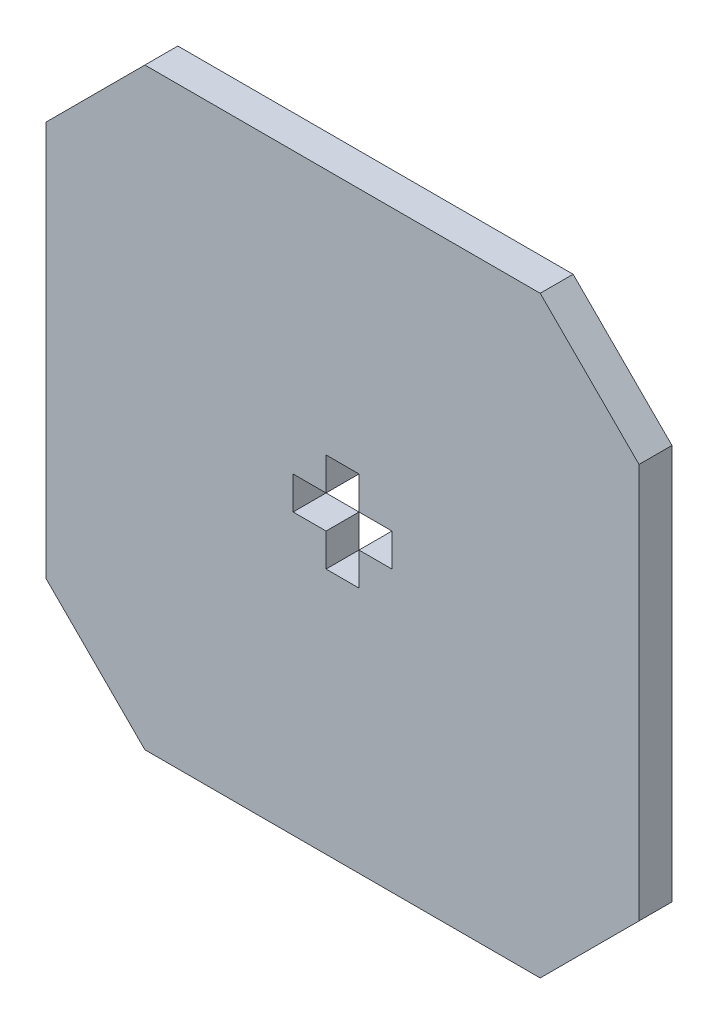
ISO-10303-21;
HEADER;
FILE_DESCRIPTION(('STEP AP214'),'2;1');
FILE_NAME('part.step','',(''),(''),'','','');
FILE_SCHEMA(('AUTOMOTIVE_DESIGN { 1 0 10303 214 1 1 1 1 }'));
ENDSEC;
DATA;
#1=APPLICATION_CONTEXT('core data for automotive mechanical design processes');
#2=APPLICATION_PROTOCOL_DEFINITION('international standard','automotive_design',2000,#1);
#3=PRODUCT_CONTEXT('',#1,'mechanical');
#4=PRODUCT('Part','Part','',(#3));
#5=PRODUCT_RELATED_PRODUCT_CATEGORY('part','',(#4));
#6=PRODUCT_DEFINITION_FORMATION('','',#4);
#7=PRODUCT_DEFINITION_CONTEXT('part definition',#1,'design');
#8=PRODUCT_DEFINITION('design','',#6,#7);
#9=PRODUCT_DEFINITION_SHAPE('','',#8);
#10=(LENGTH_UNIT() NAMED_UNIT(*) SI_UNIT(.MILLI.,.METRE.));
#11=(NAMED_UNIT(*) PLANE_ANGLE_UNIT() SI_UNIT($,.RADIAN.));
#12=(NAMED_UNIT(*) SI_UNIT($,.STERADIAN.) SOLID_ANGLE_UNIT());
#13=UNCERTAINTY_MEASURE_WITH_UNIT(LENGTH_MEASURE(1.E-05),#10,'distance_accuracy_value','');
#14=(GEOMETRIC_REPRESENTATION_CONTEXT(3) GLOBAL_UNCERTAINTY_ASSIGNED_CONTEXT((#13)) GLOBAL_UNIT_ASSIGNED_CONTEXT((#10,
#11,#12)) REPRESENTATION_CONTEXT('',''));
#15=CARTESIAN_POINT('',(0.,0.,0.));
#16=DIRECTION('',(0.,0.,1.));
#17=DIRECTION('',(1.,0.,0.));
#18=AXIS2_PLACEMENT_3D('',#15,#16,#17);
#19=CARTESIAN_POINT('',(0.,0.,3.));
#20=DIRECTION('',(0.,0.,-1.));
#21=DIRECTION('',(-1.,0.,0.));
#22=AXIS2_PLACEMENT_3D('',#19,#20,#21);
#23=PLANE('',#22);
#24=DIRECTION('',(0.,1.,0.));
#25=VECTOR('',#24,1.);
#26=CARTESIAN_POINT('',(336.000004860086,287.999995210216,3.));
#27=LINE('',#26,#25);
#28=CARTESIAN_POINT('',(336.000004860086,251.999995210216,3.));
#29=VERTEX_POINT('',#28);
#30=CARTESIAN_POINT('',(336.000004860086,287.999995210216,3.));
#31=VERTEX_POINT('',#30);
#32=EDGE_CURVE('E264',#29,#31,#27,.T.);
#33=ORIENTED_EDGE('',*,*,#32,.T.);
#34=DIRECTION('',(-0.707106781186548,0.707106781186548,0.));
#35=VECTOR('',#34,1.);
#36=CARTESIAN_POINT('',(327.000004860086,296.999995210216,3.));
#37=LINE('',#36,#35);
#38=CARTESIAN_POINT('',(327.000004860086,296.999995210216,3.));
#39=VERTEX_POINT('',#38);
#40=EDGE_CURVE('E267',#31,#39,#37,.T.);
#41=ORIENTED_EDGE('',*,*,#40,.T.);
#42=DIRECTION('',(-1.,0.,0.));
#43=VECTOR('',#42,1.);
#44=CARTESIAN_POINT('',(291.000004860086,296.999995210216,3.));
#45=LINE('',#44,#43);
#46=CARTESIAN_POINT('',(291.000004860086,296.999995210216,3.));
#47=VERTEX_POINT('',#46);
#48=EDGE_CURVE('E270',#39,#47,#45,.T.);
#49=ORIENTED_EDGE('',*,*,#48,.T.);
#50=DIRECTION('',(-0.707106781186548,-0.707106781186548,0.));
#51=VECTOR('',#50,1.);
#52=CARTESIAN_POINT('',(282.000004860086,287.999995210216,3.));
#53=LINE('',#52,#51);
#54=CARTESIAN_POINT('',(282.000004860086,287.999995210216,3.));
#55=VERTEX_POINT('',#54);
#56=EDGE_CURVE('E272',#47,#55,#53,.T.);
#57=ORIENTED_EDGE('',*,*,#56,.T.);
#58=DIRECTION('',(0.,-1.,0.));
#59=VECTOR('',#58,1.);
#60=CARTESIAN_POINT('',(282.000004860086,251.999995210216,3.));
#61=LINE('',#60,#59);
#62=CARTESIAN_POINT('',(282.000004860086,251.999995210216,3.));
#63=VERTEX_POINT('',#62);
#64=EDGE_CURVE('E274',#55,#63,#61,.T.);
#65=ORIENTED_EDGE('',*,*,#64,.T.);
#66=DIRECTION('',(0.707106781186549,-0.707106781186546,0.));
#67=VECTOR('',#66,1.);
#68=CARTESIAN_POINT('',(291.000004860086,242.999995210216,3.));
#69=LINE('',#68,#67);
#70=CARTESIAN_POINT('',(291.000004860086,242.999995210216,3.));
#71=VERTEX_POINT('',#70);
#72=EDGE_CURVE('E276',#63,#71,#69,.T.);
#73=ORIENTED_EDGE('',*,*,#72,.T.);
#74=DIRECTION('',(1.,0.,0.));
#75=VECTOR('',#74,1.);
#76=CARTESIAN_POINT('',(327.000004860086,242.999995210216,3.));
#77=LINE('',#76,#75);
#78=CARTESIAN_POINT('',(327.000004860086,242.999995210216,3.));
#79=VERTEX_POINT('',#78);
#80=EDGE_CURVE('E278',#71,#79,#77,.T.);
#81=ORIENTED_EDGE('',*,*,#80,.T.);
#82=DIRECTION('',(0.707106781186549,0.707106781186546,0.));
#83=VECTOR('',#82,1.);
#84=CARTESIAN_POINT('',(336.000004860086,251.999995210216,3.));
#85=LINE('',#84,#83);
#86=EDGE_CURVE('E280',#79,#29,#85,.T.);
#87=ORIENTED_EDGE('',*,*,#86,.T.);
#88=EDGE_LOOP('',(#33,#41,#49,#57,#65,#73,#81,#87));
#89=FACE_BOUND('',#88,.T.);
#90=DIRECTION('',(-1.,0.,0.));
#91=VECTOR('',#90,1.);
#92=CARTESIAN_POINT('',(310.500004860086,274.499995210216,3.));
#93=LINE('',#92,#91);
#94=CARTESIAN_POINT('',(310.500004860086,274.499995210216,3.));
#95=VERTEX_POINT('',#94);
#96=CARTESIAN_POINT('',(307.500004860086,274.499995210216,3.));
#97=VERTEX_POINT('',#96);
#98=EDGE_CURVE('E171',#95,#97,#93,.T.);
#99=ORIENTED_EDGE('',*,*,#98,.F.);
#100=DIRECTION('',(0.,1.,0.));
#101=VECTOR('',#100,1.);
#102=CARTESIAN_POINT('',(310.500004860086,271.499995210216,3.));
#103=LINE('',#102,#101);
#104=CARTESIAN_POINT('',(310.500004860086,271.499995210216,3.));
#105=VERTEX_POINT('',#104);
#106=EDGE_CURVE('E212',#105,#95,#103,.T.);
#107=ORIENTED_EDGE('',*,*,#106,.F.);
#108=DIRECTION('',(-1.,0.,0.));
#109=VECTOR('',#108,1.);
#110=CARTESIAN_POINT('',(313.500004860086,271.499995210216,3.));
#111=LINE('',#110,#109);
#112=CARTESIAN_POINT('',(313.500004860086,271.499995210216,3.));
#113=VERTEX_POINT('',#112);
#114=EDGE_CURVE('E210',#113,#105,#111,.T.);
#115=ORIENTED_EDGE('',*,*,#114,.F.);
#116=DIRECTION('',(0.,1.,0.));
#117=VECTOR('',#116,1.);
#118=CARTESIAN_POINT('',(313.500004860086,268.499995210216,3.));
#119=LINE('',#118,#117);
#120=CARTESIAN_POINT('',(313.500004860086,268.499995210216,3.));
#121=VERTEX_POINT('',#120);
#122=EDGE_CURVE('E208',#121,#113,#119,.T.);
#123=ORIENTED_EDGE('',*,*,#122,.F.);
#124=DIRECTION('',(1.,0.,0.));
#125=VECTOR('',#124,1.);
#126=CARTESIAN_POINT('',(310.500004860086,268.499995210216,3.));
#127=LINE('',#126,#125);
#128=CARTESIAN_POINT('',(310.500004860086,268.499995210216,3.));
#129=VERTEX_POINT('',#128);
#130=EDGE_CURVE('E206',#129,#121,#127,.T.);
#131=ORIENTED_EDGE('',*,*,#130,.F.);
#132=DIRECTION('',(0.,1.,0.));
#133=VECTOR('',#132,1.);
#134=CARTESIAN_POINT('',(310.500004860086,265.499995210216,3.));
#135=LINE('',#134,#133);
#136=CARTESIAN_POINT('',(310.500004860086,265.499995210216,3.));
#137=VERTEX_POINT('',#136);
#138=EDGE_CURVE('E204',#137,#129,#135,.T.);
#139=ORIENTED_EDGE('',*,*,#138,.F.);
#140=DIRECTION('',(1.,0.,0.));
#141=VECTOR('',#140,1.);
#142=CARTESIAN_POINT('',(307.500004860086,265.499995210216,3.));
#143=LINE('',#142,#141);
#144=CARTESIAN_POINT('',(307.500004860086,265.499995210216,3.));
#145=VERTEX_POINT('',#144);
#146=EDGE_CURVE('E202',#145,#137,#143,.T.);
#147=ORIENTED_EDGE('',*,*,#146,.F.);
#148=DIRECTION('',(0.,-1.,0.));
#149=VECTOR('',#148,1.);
#150=CARTESIAN_POINT('',(307.500004860086,268.499995210216,3.));
#151=LINE('',#150,#149);
#152=CARTESIAN_POINT('',(307.500004860086,268.499995210216,3.));
#153=VERTEX_POINT('',#152);
#154=EDGE_CURVE('E200',#153,#145,#151,.T.);
#155=ORIENTED_EDGE('',*,*,#154,.F.);
#156=DIRECTION('',(1.,0.,0.));
#157=VECTOR('',#156,1.);
#158=CARTESIAN_POINT('',(304.500004860086,268.499995210216,3.));
#159=LINE('',#158,#157);
#160=CARTESIAN_POINT('',(304.500004860086,268.499995210216,3.));
#161=VERTEX_POINT('',#160);
#162=EDGE_CURVE('E198',#161,#153,#159,.T.);
#163=ORIENTED_EDGE('',*,*,#162,.F.);
#164=DIRECTION('',(0.,-1.,0.));
#165=VECTOR('',#164,1.);
#166=CARTESIAN_POINT('',(304.500004860086,271.499995210216,3.));
#167=LINE('',#166,#165);
#168=CARTESIAN_POINT('',(304.500004860086,271.499995210216,3.));
#169=VERTEX_POINT('',#168);
#170=EDGE_CURVE('E194',#169,#161,#167,.T.);
#171=ORIENTED_EDGE('',*,*,#170,.F.);
#172=DIRECTION('',(-1.,0.,0.));
#173=VECTOR('',#172,1.);
#174=CARTESIAN_POINT('',(307.500004860086,271.499995210216,3.));
#175=LINE('',#174,#173);
#176=CARTESIAN_POINT('',(307.500004860086,271.499995210216,3.));
#177=VERTEX_POINT('',#176);
#178=EDGE_CURVE('E192',#177,#169,#175,.T.);
#179=ORIENTED_EDGE('',*,*,#178,.F.);
#180=DIRECTION('',(0.,-1.,0.));
#181=VECTOR('',#180,1.);
#182=CARTESIAN_POINT('',(307.500004860086,274.499995210216,3.));
#183=LINE('',#182,#181);
#184=EDGE_CURVE('E179',#97,#177,#183,.T.);
#185=ORIENTED_EDGE('',*,*,#184,.F.);
#186=EDGE_LOOP('',(#99,#107,#115,#123,#131,#139,#147,#155,#163,#171,#179,#185));
#187=FACE_BOUND('',#186,.T.);
#188=ADVANCED_FACE('F34',(#89,#187),#23,.F.);
#189=CARTESIAN_POINT('',(0.,0.,0.));
#190=DIRECTION('',(0.,0.,-1.));
#191=DIRECTION('',(-1.,0.,0.));
#192=AXIS2_PLACEMENT_3D('',#189,#190,#191);
#193=PLANE('',#192);
#194=DIRECTION('',(0.,1.,0.));
#195=VECTOR('',#194,1.);
#196=CARTESIAN_POINT('',(336.000004860086,287.999995210216,0.));
#197=LINE('',#196,#195);
#198=CARTESIAN_POINT('',(336.000004860086,251.999995210216,0.));
#199=VERTEX_POINT('',#198);
#200=CARTESIAN_POINT('',(336.000004860086,287.999995210216,0.));
#201=VERTEX_POINT('',#200);
#202=EDGE_CURVE('E187',#199,#201,#197,.T.);
#203=ORIENTED_EDGE('',*,*,#202,.F.);
#204=DIRECTION('',(0.707106781186549,0.707106781186546,0.));
#205=VECTOR('',#204,1.);
#206=CARTESIAN_POINT('',(336.000004860086,251.999995210216,0.));
#207=LINE('',#206,#205);
#208=CARTESIAN_POINT('',(327.000004860086,242.999995210216,0.));
#209=VERTEX_POINT('',#208);
#210=EDGE_CURVE('E268',#209,#199,#207,.T.);
#211=ORIENTED_EDGE('',*,*,#210,.F.);
#212=DIRECTION('',(1.,0.,0.));
#213=VECTOR('',#212,1.);
#214=CARTESIAN_POINT('',(327.000004860086,242.999995210216,0.));
#215=LINE('',#214,#213);
#216=CARTESIAN_POINT('',(291.000004860086,242.999995210216,0.));
#217=VERTEX_POINT('',#216);
#218=EDGE_CURVE('E295',#217,#209,#215,.T.);
#219=ORIENTED_EDGE('',*,*,#218,.F.);
#220=DIRECTION('',(0.707106781186549,-0.707106781186546,0.));
#221=VECTOR('',#220,1.);
#222=CARTESIAN_POINT('',(291.000004860086,242.999995210216,0.));
#223=LINE('',#222,#221);
#224=CARTESIAN_POINT('',(282.000004860086,251.999995210216,0.));
#225=VERTEX_POINT('',#224);
#226=EDGE_CURVE('E293',#225,#217,#223,.T.);
#227=ORIENTED_EDGE('',*,*,#226,.F.);
#228=DIRECTION('',(0.,-1.,0.));
#229=VECTOR('',#228,1.);
#230=CARTESIAN_POINT('',(282.000004860086,251.999995210216,0.));
#231=LINE('',#230,#229);
#232=CARTESIAN_POINT('',(282.000004860086,287.999995210216,0.));
#233=VERTEX_POINT('',#232);
#234=EDGE_CURVE('E291',#233,#225,#231,.T.);
#235=ORIENTED_EDGE('',*,*,#234,.F.);
#236=DIRECTION('',(-0.707106781186548,-0.707106781186548,0.));
#237=VECTOR('',#236,1.);
#238=CARTESIAN_POINT('',(282.000004860086,287.999995210216,0.));
#239=LINE('',#238,#237);
#240=CARTESIAN_POINT('',(291.000004860086,296.999995210216,0.));
#241=VERTEX_POINT('',#240);
#242=EDGE_CURVE('E289',#241,#233,#239,.T.);
#243=ORIENTED_EDGE('',*,*,#242,.F.);
#244=DIRECTION('',(-1.,0.,0.));
#245=VECTOR('',#244,1.);
#246=CARTESIAN_POINT('',(291.000004860086,296.999995210216,0.));
#247=LINE('',#246,#245);
#248=CARTESIAN_POINT('',(327.000004860086,296.999995210216,0.));
#249=VERTEX_POINT('',#248);
#250=EDGE_CURVE('E287',#249,#241,#247,.T.);
#251=ORIENTED_EDGE('',*,*,#250,.F.);
#252=DIRECTION('',(-0.707106781186548,0.707106781186548,0.));
#253=VECTOR('',#252,1.);
#254=CARTESIAN_POINT('',(327.000004860086,296.999995210216,0.));
#255=LINE('',#254,#253);
#256=EDGE_CURVE('E285',#201,#249,#255,.T.);
#257=ORIENTED_EDGE('',*,*,#256,.F.);
#258=EDGE_LOOP('',(#203,#211,#219,#227,#235,#243,#251,#257));
#259=FACE_BOUND('',#258,.T.);
#260=DIRECTION('',(0.,1.,0.));
#261=VECTOR('',#260,1.);
#262=CARTESIAN_POINT('',(310.500004860086,271.499995210216,0.));
#263=LINE('',#262,#261);
#264=CARTESIAN_POINT('',(310.500004860086,271.499995210216,0.));
#265=VERTEX_POINT('',#264);
#266=CARTESIAN_POINT('',(310.500004860086,274.499995210216,0.));
#267=VERTEX_POINT('',#266);
#268=EDGE_CURVE('E180',#265,#267,#263,.T.);
#269=ORIENTED_EDGE('',*,*,#268,.T.);
#270=DIRECTION('',(-1.,0.,0.));
#271=VECTOR('',#270,1.);
#272=CARTESIAN_POINT('',(310.500004860086,274.499995210216,0.));
#273=LINE('',#272,#271);
#274=CARTESIAN_POINT('',(307.500004860086,274.499995210216,0.));
#275=VERTEX_POINT('',#274);
#276=EDGE_CURVE('E57',#267,#275,#273,.T.);
#277=ORIENTED_EDGE('',*,*,#276,.T.);
#278=DIRECTION('',(0.,-1.,0.));
#279=VECTOR('',#278,1.);
#280=CARTESIAN_POINT('',(307.500004860086,274.499995210216,0.));
#281=LINE('',#280,#279);
#282=CARTESIAN_POINT('',(307.500004860086,271.499995210216,0.));
#283=VERTEX_POINT('',#282);
#284=EDGE_CURVE('E186',#275,#283,#281,.T.);
#285=ORIENTED_EDGE('',*,*,#284,.T.);
#286=DIRECTION('',(-1.,0.,0.));
#287=VECTOR('',#286,1.);
#288=CARTESIAN_POINT('',(307.500004860086,271.499995210216,0.));
#289=LINE('',#288,#287);
#290=CARTESIAN_POINT('',(304.500004860086,271.499995210216,0.));
#291=VERTEX_POINT('',#290);
#292=EDGE_CURVE('E216',#283,#291,#289,.T.);
#293=ORIENTED_EDGE('',*,*,#292,.T.);
#294=DIRECTION('',(0.,-1.,0.));
#295=VECTOR('',#294,1.);
#296=CARTESIAN_POINT('',(304.500004860086,271.499995210216,0.));
#297=LINE('',#296,#295);
#298=CARTESIAN_POINT('',(304.500004860086,268.499995210216,0.));
#299=VERTEX_POINT('',#298);
#300=EDGE_CURVE('E219',#291,#299,#297,.T.);
#301=ORIENTED_EDGE('',*,*,#300,.T.);
#302=DIRECTION('',(1.,0.,0.));
#303=VECTOR('',#302,1.);
#304=CARTESIAN_POINT('',(304.500004860086,268.499995210216,0.));
#305=LINE('',#304,#303);
#306=CARTESIAN_POINT('',(307.500004860086,268.499995210216,0.));
#307=VERTEX_POINT('',#306);
#308=EDGE_CURVE('E222',#299,#307,#305,.T.);
#309=ORIENTED_EDGE('',*,*,#308,.T.);
#310=DIRECTION('',(0.,-1.,0.));
#311=VECTOR('',#310,1.);
#312=CARTESIAN_POINT('',(307.500004860086,268.499995210216,0.));
#313=LINE('',#312,#311);
#314=CARTESIAN_POINT('',(307.500004860086,265.499995210216,0.));
#315=VERTEX_POINT('',#314);
#316=EDGE_CURVE('E225',#307,#315,#313,.T.);
#317=ORIENTED_EDGE('',*,*,#316,.T.);
#318=DIRECTION('',(1.,0.,0.));
#319=VECTOR('',#318,1.);
#320=CARTESIAN_POINT('',(307.500004860086,265.499995210216,0.));
#321=LINE('',#320,#319);
#322=CARTESIAN_POINT('',(310.500004860086,265.499995210216,0.));
#323=VERTEX_POINT('',#322);
#324=EDGE_CURVE('E228',#315,#323,#321,.T.);
#325=ORIENTED_EDGE('',*,*,#324,.T.);
#326=DIRECTION('',(0.,1.,0.));
#327=VECTOR('',#326,1.);
#328=CARTESIAN_POINT('',(310.500004860086,265.499995210216,0.));
#329=LINE('',#328,#327);
#330=CARTESIAN_POINT('',(310.500004860086,268.499995210216,0.));
#331=VERTEX_POINT('',#330);
#332=EDGE_CURVE('E231',#323,#331,#329,.T.);
#333=ORIENTED_EDGE('',*,*,#332,.T.);
#334=DIRECTION('',(1.,0.,0.));
#335=VECTOR('',#334,1.);
#336=CARTESIAN_POINT('',(310.500004860086,268.499995210216,0.));
#337=LINE('',#336,#335);
#338=CARTESIAN_POINT('',(313.500004860086,268.499995210216,0.));
#339=VERTEX_POINT('',#338);
#340=EDGE_CURVE('E234',#331,#339,#337,.T.);
#341=ORIENTED_EDGE('',*,*,#340,.T.);
#342=DIRECTION('',(0.,1.,0.));
#343=VECTOR('',#342,1.);
#344=CARTESIAN_POINT('',(313.500004860086,268.499995210216,0.));
#345=LINE('',#344,#343);
#346=CARTESIAN_POINT('',(313.500004860086,271.499995210216,0.));
#347=VERTEX_POINT('',#346);
#348=EDGE_CURVE('E237',#339,#347,#345,.T.);
#349=ORIENTED_EDGE('',*,*,#348,.T.);
#350=DIRECTION('',(-1.,0.,0.));
#351=VECTOR('',#350,1.);
#352=CARTESIAN_POINT('',(313.500004860086,271.499995210216,0.));
#353=LINE('',#352,#351);
#354=EDGE_CURVE('E240',#347,#265,#353,.T.);
#355=ORIENTED_EDGE('',*,*,#354,.T.);
#356=EDGE_LOOP('',(#269,#277,#285,#293,#301,#309,#317,#325,#333,#341,#349,#355));
#357=FACE_BOUND('',#356,.T.);
#358=ADVANCED_FACE('F325',(#259,#357),#193,.T.);
#359=CARTESIAN_POINT('',(336.000004860086,287.999995210216,3.));
#360=DIRECTION('',(-1.,0.,0.));
#361=DIRECTION('',(0.,0.,1.));
#362=AXIS2_PLACEMENT_3D('',#359,#360,#361);
#363=PLANE('',#362);
#364=ORIENTED_EDGE('',*,*,#202,.T.);
#365=DIRECTION('',(0.,0.,-1.));
#366=VECTOR('',#365,1.);
#367=CARTESIAN_POINT('',(336.000004860086,287.999995210216,3.));
#368=LINE('',#367,#366);
#369=EDGE_CURVE('E11',#31,#201,#368,.T.);
#370=ORIENTED_EDGE('',*,*,#369,.F.);
#371=ORIENTED_EDGE('',*,*,#32,.F.);
#372=DIRECTION('',(0.,0.,-1.));
#373=VECTOR('',#372,1.);
#374=CARTESIAN_POINT('',(336.000004860086,251.999995210216,3.));
#375=LINE('',#374,#373);
#376=EDGE_CURVE('E282',#29,#199,#375,.T.);
#377=ORIENTED_EDGE('',*,*,#376,.T.);
#378=EDGE_LOOP('',(#364,#370,#371,#377));
#379=FACE_BOUND('',#378,.T.);
#380=ADVANCED_FACE('F36',(#379),#363,.F.);
#381=CARTESIAN_POINT('',(327.000004860086,296.999995210216,3.));
#382=DIRECTION('',(-0.707106781186547,-0.707106781186547,0.));
#383=DIRECTION('',(0.707106781186548,-0.707106781186548,0.));
#384=AXIS2_PLACEMENT_3D('',#381,#382,#383);
#385=PLANE('',#384);
#386=ORIENTED_EDGE('',*,*,#256,.T.);
#387=DIRECTION('',(0.,0.,-1.));
#388=VECTOR('',#387,1.);
#389=CARTESIAN_POINT('',(327.000004860086,296.999995210216,3.));
#390=LINE('',#389,#388);
#391=EDGE_CURVE('E42',#39,#249,#390,.T.);
#392=ORIENTED_EDGE('',*,*,#391,.F.);
#393=ORIENTED_EDGE('',*,*,#40,.F.);
#394=ORIENTED_EDGE('',*,*,#369,.T.);
#395=EDGE_LOOP('',(#386,#392,#393,#394));
#396=FACE_BOUND('',#395,.T.);
#397=ADVANCED_FACE('F342',(#396),#385,.F.);
#398=CARTESIAN_POINT('',(291.000004860086,296.999995210216,3.));
#399=DIRECTION('',(0.,-1.,0.));
#400=DIRECTION('',(0.,0.,-1.));
#401=AXIS2_PLACEMENT_3D('',#398,#399,#400);
#402=PLANE('',#401);
#403=ORIENTED_EDGE('',*,*,#250,.T.);
#404=DIRECTION('',(0.,0.,-1.));
#405=VECTOR('',#404,1.);
#406=CARTESIAN_POINT('',(291.000004860086,296.999995210216,3.));
#407=LINE('',#406,#405);
#408=EDGE_CURVE('E312',#47,#241,#407,.T.);
#409=ORIENTED_EDGE('',*,*,#408,.F.);
#410=ORIENTED_EDGE('',*,*,#48,.F.);
#411=ORIENTED_EDGE('',*,*,#391,.T.);
#412=EDGE_LOOP('',(#403,#409,#410,#411));
#413=FACE_BOUND('',#412,.T.);
#414=ADVANCED_FACE('F319',(#413),#402,.F.);
#415=CARTESIAN_POINT('',(282.000004860086,287.999995210216,3.));
#416=DIRECTION('',(0.707106781186547,-0.707106781186547,0.));
#417=DIRECTION('',(0.707106781186548,0.707106781186548,0.));
#418=AXIS2_PLACEMENT_3D('',#415,#416,#417);
#419=PLANE('',#418);
#420=ORIENTED_EDGE('',*,*,#242,.T.);
#421=DIRECTION('',(0.,0.,-1.));
#422=VECTOR('',#421,1.);
#423=CARTESIAN_POINT('',(282.000004860086,287.999995210216,3.));
#424=LINE('',#423,#422);
#425=EDGE_CURVE('E309',#55,#233,#424,.T.);
#426=ORIENTED_EDGE('',*,*,#425,.F.);
#427=ORIENTED_EDGE('',*,*,#56,.F.);
#428=ORIENTED_EDGE('',*,*,#408,.T.);
#429=EDGE_LOOP('',(#420,#426,#427,#428));
#430=FACE_BOUND('',#429,.T.);
#431=ADVANCED_FACE('F331',(#430),#419,.F.);
#432=CARTESIAN_POINT('',(282.000004860086,251.999995210216,3.));
#433=DIRECTION('',(1.,0.,0.));
#434=DIRECTION('',(0.,0.,-1.));
#435=AXIS2_PLACEMENT_3D('',#432,#433,#434);
#436=PLANE('',#435);
#437=ORIENTED_EDGE('',*,*,#234,.T.);
#438=DIRECTION('',(0.,0.,-1.));
#439=VECTOR('',#438,1.);
#440=CARTESIAN_POINT('',(282.000004860086,251.999995210216,3.));
#441=LINE('',#440,#439);
#442=EDGE_CURVE('E306',#63,#225,#441,.T.);
#443=ORIENTED_EDGE('',*,*,#442,.F.);
#444=ORIENTED_EDGE('',*,*,#64,.F.);
#445=ORIENTED_EDGE('',*,*,#425,.T.);
#446=EDGE_LOOP('',(#437,#443,#444,#445));
#447=FACE_BOUND('',#446,.T.);
#448=ADVANCED_FACE('F335',(#447),#436,.F.);
#449=CARTESIAN_POINT('',(291.000004860086,242.999995210216,3.));
#450=DIRECTION('',(0.707106781186546,0.707106781186548,0.));
#451=DIRECTION('',(-0.707106781186549,0.707106781186546,0.));
#452=AXIS2_PLACEMENT_3D('',#449,#450,#451);
#453=PLANE('',#452);
#454=ORIENTED_EDGE('',*,*,#226,.T.);
#455=DIRECTION('',(0.,0.,-1.));
#456=VECTOR('',#455,1.);
#457=CARTESIAN_POINT('',(291.000004860086,242.999995210216,3.));
#458=LINE('',#457,#456);
#459=EDGE_CURVE('E303',#71,#217,#458,.T.);
#460=ORIENTED_EDGE('',*,*,#459,.F.);
#461=ORIENTED_EDGE('',*,*,#72,.F.);
#462=ORIENTED_EDGE('',*,*,#442,.T.);
#463=EDGE_LOOP('',(#454,#460,#461,#462));
#464=FACE_BOUND('',#463,.T.);
#465=ADVANCED_FACE('F355',(#464),#453,.F.);
#466=CARTESIAN_POINT('',(327.000004860086,242.999995210216,3.));
#467=DIRECTION('',(0.,1.,0.));
#468=DIRECTION('',(0.,0.,1.));
#469=AXIS2_PLACEMENT_3D('',#466,#467,#468);
#470=PLANE('',#469);
#471=ORIENTED_EDGE('',*,*,#218,.T.);
#472=DIRECTION('',(0.,0.,-1.));
#473=VECTOR('',#472,1.);
#474=CARTESIAN_POINT('',(327.000004860086,242.999995210216,3.));
#475=LINE('',#474,#473);
#476=EDGE_CURVE('E300',#79,#209,#475,.T.);
#477=ORIENTED_EDGE('',*,*,#476,.F.);
#478=ORIENTED_EDGE('',*,*,#80,.F.);
#479=ORIENTED_EDGE('',*,*,#459,.T.);
#480=EDGE_LOOP('',(#471,#477,#478,#479));
#481=FACE_BOUND('',#480,.T.);
#482=ADVANCED_FACE('F353',(#481),#470,.F.);
#483=CARTESIAN_POINT('',(336.000004860086,251.999995210216,3.));
#484=DIRECTION('',(-0.707106781186546,0.707106781186548,0.));
#485=DIRECTION('',(-0.707106781186549,-0.707106781186546,0.));
#486=AXIS2_PLACEMENT_3D('',#483,#484,#485);
#487=PLANE('',#486);
#488=ORIENTED_EDGE('',*,*,#210,.T.);
#489=ORIENTED_EDGE('',*,*,#376,.F.);
#490=ORIENTED_EDGE('',*,*,#86,.F.);
#491=ORIENTED_EDGE('',*,*,#476,.T.);
#492=EDGE_LOOP('',(#488,#489,#490,#491));
#493=FACE_BOUND('',#492,.T.);
#494=ADVANCED_FACE('F348',(#493),#487,.F.);
#495=CARTESIAN_POINT('',(310.500004860086,274.499995210216,3.));
#496=DIRECTION('',(0.,-1.,0.));
#497=DIRECTION('',(0.,0.,-1.));
#498=AXIS2_PLACEMENT_3D('',#495,#496,#497);
#499=PLANE('',#498);
#500=ORIENTED_EDGE('',*,*,#276,.F.);
#501=DIRECTION('',(0.,0.,-1.));
#502=VECTOR('',#501,1.);
#503=CARTESIAN_POINT('',(310.500004860086,274.499995210216,3.));
#504=LINE('',#503,#502);
#505=EDGE_CURVE('E175',#95,#267,#504,.T.);
#506=ORIENTED_EDGE('',*,*,#505,.F.);
#507=ORIENTED_EDGE('',*,*,#98,.T.);
#508=DIRECTION('',(0.,0.,-1.));
#509=VECTOR('',#508,1.);
#510=CARTESIAN_POINT('',(307.500004860086,274.499995210216,3.));
#511=LINE('',#510,#509);
#512=EDGE_CURVE('E174',#97,#275,#511,.T.);
#513=ORIENTED_EDGE('',*,*,#512,.T.);
#514=EDGE_LOOP('',(#500,#506,#507,#513));
#515=FACE_BOUND('',#514,.T.);
#516=ADVANCED_FACE('F173',(#515),#499,.T.);
#517=CARTESIAN_POINT('',(307.500004860086,274.499995210216,3.));
#518=DIRECTION('',(1.,0.,0.));
#519=DIRECTION('',(0.,0.,-1.));
#520=AXIS2_PLACEMENT_3D('',#517,#518,#519);
#521=PLANE('',#520);
#522=ORIENTED_EDGE('',*,*,#284,.F.);
#523=ORIENTED_EDGE('',*,*,#512,.F.);
#524=ORIENTED_EDGE('',*,*,#184,.T.);
#525=DIRECTION('',(0.,0.,-1.));
#526=VECTOR('',#525,1.);
#527=CARTESIAN_POINT('',(307.500004860086,271.499995210216,3.));
#528=LINE('',#527,#526);
#529=EDGE_CURVE('E188',#177,#283,#528,.T.);
#530=ORIENTED_EDGE('',*,*,#529,.T.);
#531=EDGE_LOOP('',(#522,#523,#524,#530));
#532=FACE_BOUND('',#531,.T.);
#533=ADVANCED_FACE('F183',(#532),#521,.T.);
#534=CARTESIAN_POINT('',(307.500004860086,271.499995210216,3.));
#535=DIRECTION('',(0.,-1.,0.));
#536=DIRECTION('',(0.,0.,-1.));
#537=AXIS2_PLACEMENT_3D('',#534,#535,#536);
#538=PLANE('',#537);
#539=ORIENTED_EDGE('',*,*,#292,.F.);
#540=ORIENTED_EDGE('',*,*,#529,.F.);
#541=ORIENTED_EDGE('',*,*,#178,.T.);
#542=DIRECTION('',(0.,0.,-1.));
#543=VECTOR('',#542,1.);
#544=CARTESIAN_POINT('',(304.500004860086,271.499995210216,3.));
#545=LINE('',#544,#543);
#546=EDGE_CURVE('E261',#169,#291,#545,.T.);
#547=ORIENTED_EDGE('',*,*,#546,.T.);
#548=EDGE_LOOP('',(#539,#540,#541,#547));
#549=FACE_BOUND('',#548,.T.);
#550=ADVANCED_FACE('F380',(#549),#538,.T.);
#551=CARTESIAN_POINT('',(304.500004860086,271.499995210216,3.));
#552=DIRECTION('',(1.,0.,0.));
#553=DIRECTION('',(0.,0.,-1.));
#554=AXIS2_PLACEMENT_3D('',#551,#552,#553);
#555=PLANE('',#554);
#556=ORIENTED_EDGE('',*,*,#300,.F.);
#557=ORIENTED_EDGE('',*,*,#546,.F.);
#558=ORIENTED_EDGE('',*,*,#170,.T.);
#559=DIRECTION('',(0.,0.,-1.));
#560=VECTOR('',#559,1.);
#561=CARTESIAN_POINT('',(304.500004860086,268.499995210216,3.));
#562=LINE('',#561,#560);
#563=EDGE_CURVE('E259',#161,#299,#562,.T.);
#564=ORIENTED_EDGE('',*,*,#563,.T.);
#565=EDGE_LOOP('',(#556,#557,#558,#564));
#566=FACE_BOUND('',#565,.T.);
#567=ADVANCED_FACE('F384',(#566),#555,.T.);
#568=CARTESIAN_POINT('',(304.500004860086,268.499995210216,3.));
#569=DIRECTION('',(0.,1.,0.));
#570=DIRECTION('',(0.,0.,1.));
#571=AXIS2_PLACEMENT_3D('',#568,#569,#570);
#572=PLANE('',#571);
#573=ORIENTED_EDGE('',*,*,#308,.F.);
#574=ORIENTED_EDGE('',*,*,#563,.F.);
#575=ORIENTED_EDGE('',*,*,#162,.T.);
#576=DIRECTION('',(0.,0.,-1.));
#577=VECTOR('',#576,1.);
#578=CARTESIAN_POINT('',(307.500004860086,268.499995210216,3.));
#579=LINE('',#578,#577);
#580=EDGE_CURVE('E257',#153,#307,#579,.T.);
#581=ORIENTED_EDGE('',*,*,#580,.T.);
#582=EDGE_LOOP('',(#573,#574,#575,#581));
#583=FACE_BOUND('',#582,.T.);
#584=ADVANCED_FACE('F390',(#583),#572,.T.);
#585=CARTESIAN_POINT('',(307.500004860086,268.499995210216,3.));
#586=DIRECTION('',(1.,0.,0.));
#587=DIRECTION('',(0.,0.,-1.));
#588=AXIS2_PLACEMENT_3D('',#585,#586,#587);
#589=PLANE('',#588);
#590=ORIENTED_EDGE('',*,*,#316,.F.);
#591=ORIENTED_EDGE('',*,*,#580,.F.);
#592=ORIENTED_EDGE('',*,*,#154,.T.);
#593=DIRECTION('',(0.,0.,-1.));
#594=VECTOR('',#593,1.);
#595=CARTESIAN_POINT('',(307.500004860086,265.499995210216,3.));
#596=LINE('',#595,#594);
#597=EDGE_CURVE('E255',#145,#315,#596,.T.);
#598=ORIENTED_EDGE('',*,*,#597,.T.);
#599=EDGE_LOOP('',(#590,#591,#592,#598));
#600=FACE_BOUND('',#599,.T.);
#601=ADVANCED_FACE('F394',(#600),#589,.T.);
#602=CARTESIAN_POINT('',(307.500004860086,265.499995210216,3.));
#603=DIRECTION('',(0.,1.,0.));
#604=DIRECTION('',(0.,0.,1.));
#605=AXIS2_PLACEMENT_3D('',#602,#603,#604);
#606=PLANE('',#605);
#607=ORIENTED_EDGE('',*,*,#324,.F.);
#608=ORIENTED_EDGE('',*,*,#597,.F.);
#609=ORIENTED_EDGE('',*,*,#146,.T.);
#610=DIRECTION('',(0.,0.,-1.));
#611=VECTOR('',#610,1.);
#612=CARTESIAN_POINT('',(310.500004860086,265.499995210216,3.));
#613=LINE('',#612,#611);
#614=EDGE_CURVE('E253',#137,#323,#613,.T.);
#615=ORIENTED_EDGE('',*,*,#614,.T.);
#616=EDGE_LOOP('',(#607,#608,#609,#615));
#617=FACE_BOUND('',#616,.T.);
#618=ADVANCED_FACE('F398',(#617),#606,.T.);
#619=CARTESIAN_POINT('',(310.500004860086,265.499995210216,3.));
#620=DIRECTION('',(-1.,0.,0.));
#621=DIRECTION('',(0.,0.,1.));
#622=AXIS2_PLACEMENT_3D('',#619,#620,#621);
#623=PLANE('',#622);
#624=ORIENTED_EDGE('',*,*,#332,.F.);
#625=ORIENTED_EDGE('',*,*,#614,.F.);
#626=ORIENTED_EDGE('',*,*,#138,.T.);
#627=DIRECTION('',(0.,0.,-1.));
#628=VECTOR('',#627,1.);
#629=CARTESIAN_POINT('',(310.500004860086,268.499995210216,3.));
#630=LINE('',#629,#628);
#631=EDGE_CURVE('E251',#129,#331,#630,.T.);
#632=ORIENTED_EDGE('',*,*,#631,.T.);
#633=EDGE_LOOP('',(#624,#625,#626,#632));
#634=FACE_BOUND('',#633,.T.);
#635=ADVANCED_FACE('F402',(#634),#623,.T.);
#636=CARTESIAN_POINT('',(310.500004860086,268.499995210216,3.));
#637=DIRECTION('',(0.,1.,0.));
#638=DIRECTION('',(0.,0.,1.));
#639=AXIS2_PLACEMENT_3D('',#636,#637,#638);
#640=PLANE('',#639);
#641=ORIENTED_EDGE('',*,*,#340,.F.);
#642=ORIENTED_EDGE('',*,*,#631,.F.);
#643=ORIENTED_EDGE('',*,*,#130,.T.);
#644=DIRECTION('',(0.,0.,-1.));
#645=VECTOR('',#644,1.);
#646=CARTESIAN_POINT('',(313.500004860086,268.499995210216,3.));
#647=LINE('',#646,#645);
#648=EDGE_CURVE('E249',#121,#339,#647,.T.);
#649=ORIENTED_EDGE('',*,*,#648,.T.);
#650=EDGE_LOOP('',(#641,#642,#643,#649));
#651=FACE_BOUND('',#650,.T.);
#652=ADVANCED_FACE('F406',(#651),#640,.T.);
#653=CARTESIAN_POINT('',(313.500004860086,268.499995210216,3.));
#654=DIRECTION('',(-1.,0.,0.));
#655=DIRECTION('',(0.,0.,1.));
#656=AXIS2_PLACEMENT_3D('',#653,#654,#655);
#657=PLANE('',#656);
#658=ORIENTED_EDGE('',*,*,#348,.F.);
#659=ORIENTED_EDGE('',*,*,#648,.F.);
#660=ORIENTED_EDGE('',*,*,#122,.T.);
#661=DIRECTION('',(0.,0.,-1.));
#662=VECTOR('',#661,1.);
#663=CARTESIAN_POINT('',(313.500004860086,271.499995210216,3.));
#664=LINE('',#663,#662);
#665=EDGE_CURVE('E247',#113,#347,#664,.T.);
#666=ORIENTED_EDGE('',*,*,#665,.T.);
#667=EDGE_LOOP('',(#658,#659,#660,#666));
#668=FACE_BOUND('',#667,.T.);
#669=ADVANCED_FACE('F410',(#668),#657,.T.);
#670=CARTESIAN_POINT('',(313.500004860086,271.499995210216,3.));
#671=DIRECTION('',(0.,-1.,0.));
#672=DIRECTION('',(0.,0.,-1.));
#673=AXIS2_PLACEMENT_3D('',#670,#671,#672);
#674=PLANE('',#673);
#675=ORIENTED_EDGE('',*,*,#354,.F.);
#676=ORIENTED_EDGE('',*,*,#665,.F.);
#677=ORIENTED_EDGE('',*,*,#114,.T.);
#678=DIRECTION('',(0.,0.,-1.));
#679=VECTOR('',#678,1.);
#680=CARTESIAN_POINT('',(310.500004860086,271.499995210216,3.));
#681=LINE('',#680,#679);
#682=EDGE_CURVE('E49',#105,#265,#681,.T.);
#683=ORIENTED_EDGE('',*,*,#682,.T.);
#684=EDGE_LOOP('',(#675,#676,#677,#683));
#685=FACE_BOUND('',#684,.T.);
#686=ADVANCED_FACE('F414',(#685),#674,.T.);
#687=CARTESIAN_POINT('',(310.500004860086,271.499995210216,3.));
#688=DIRECTION('',(-1.,0.,0.));
#689=DIRECTION('',(0.,0.,1.));
#690=AXIS2_PLACEMENT_3D('',#687,#688,#689);
#691=PLANE('',#690);
#692=ORIENTED_EDGE('',*,*,#268,.F.);
#693=ORIENTED_EDGE('',*,*,#682,.F.);
#694=ORIENTED_EDGE('',*,*,#106,.T.);
#695=ORIENTED_EDGE('',*,*,#505,.T.);
#696=EDGE_LOOP('',(#692,#693,#694,#695));
#697=FACE_BOUND('',#696,.T.);
#698=ADVANCED_FACE('F418',(#697),#691,.T.);
#699=CLOSED_SHELL('',(#188,#358,#380,#397,#414,#431,#448,#465,#482,#494,#516,#533,#550,#567,
#584,#601,#618,#635,#652,#669,#686,#698));
#700=MANIFOLD_SOLID_BREP('B2',#699);
#701=ADVANCED_BREP_SHAPE_REPRESENTATION('',(#18,#700),#14);
#702=SHAPE_DEFINITION_REPRESENTATION(#9,#701);
ENDSEC;
END-ISO-10303-21;
